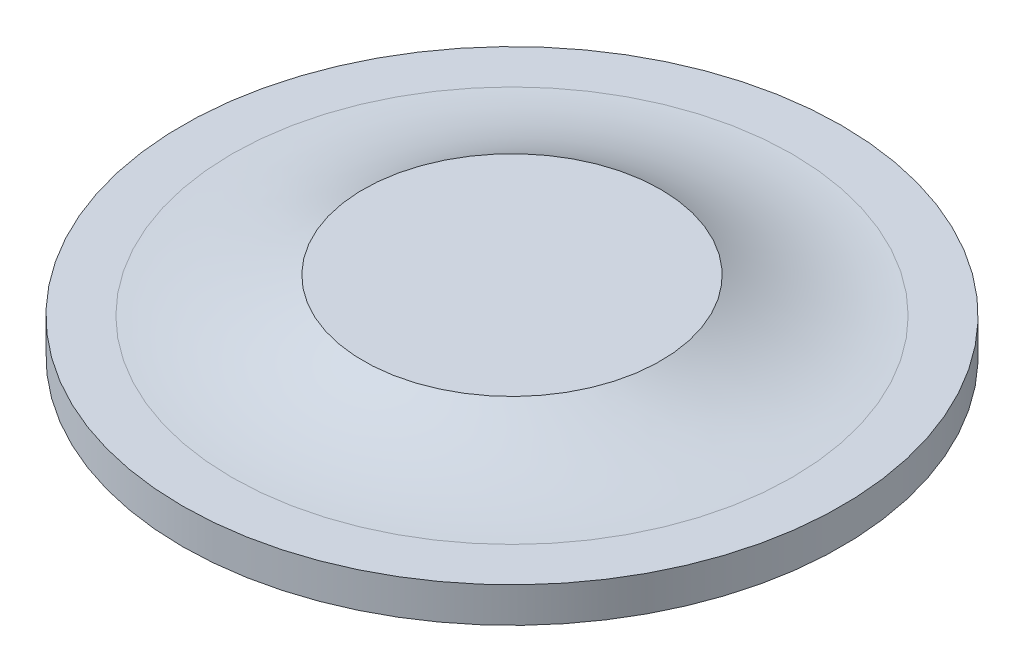
ISO-10303-21;
HEADER;
FILE_DESCRIPTION(('STEP AP214'),'2;1');
FILE_NAME('part.step','',(''),(''),'','','');
FILE_SCHEMA(('AUTOMOTIVE_DESIGN { 1 0 10303 214 1 1 1 1 }'));
ENDSEC;
DATA;
#1=APPLICATION_CONTEXT('core data for automotive mechanical design processes');
#2=APPLICATION_PROTOCOL_DEFINITION('international standard','automotive_design',2000,#1);
#3=PRODUCT_CONTEXT('',#1,'mechanical');
#4=PRODUCT('Part','Part','',(#3));
#5=PRODUCT_RELATED_PRODUCT_CATEGORY('part','',(#4));
#6=PRODUCT_DEFINITION_FORMATION('','',#4);
#7=PRODUCT_DEFINITION_CONTEXT('part definition',#1,'design');
#8=PRODUCT_DEFINITION('design','',#6,#7);
#9=PRODUCT_DEFINITION_SHAPE('','',#8);
#10=(LENGTH_UNIT() NAMED_UNIT(*) SI_UNIT(.MILLI.,.METRE.));
#11=(NAMED_UNIT(*) PLANE_ANGLE_UNIT() SI_UNIT($,.RADIAN.));
#12=(NAMED_UNIT(*) SI_UNIT($,.STERADIAN.) SOLID_ANGLE_UNIT());
#13=UNCERTAINTY_MEASURE_WITH_UNIT(LENGTH_MEASURE(1.E-05),#10,'distance_accuracy_value','');
#14=(GEOMETRIC_REPRESENTATION_CONTEXT(3) GLOBAL_UNCERTAINTY_ASSIGNED_CONTEXT((#13)) GLOBAL_UNIT_ASSIGNED_CONTEXT((#10,
#11,#12)) REPRESENTATION_CONTEXT('',''));
#15=CARTESIAN_POINT('',(0.,0.,0.));
#16=DIRECTION('',(0.,0.,1.));
#17=DIRECTION('',(1.,0.,0.));
#18=AXIS2_PLACEMENT_3D('',#15,#16,#17);
#19=CARTESIAN_POINT('',(0.,67.9531250000001,0.));
#20=DIRECTION('',(0.,-1.,0.));
#21=DIRECTION('',(0.,0.,-1.));
#22=AXIS2_PLACEMENT_3D('',#19,#20,#21);
#23=TOROIDAL_SURFACE('',#22,63.75,59.9531250000001);
#24=CARTESIAN_POINT('',(0.,8.00000000000001,0.));
#25=DIRECTION('',(0.,-1.,0.));
#26=DIRECTION('',(0.,0.,-1.));
#27=AXIS2_PLACEMENT_3D('',#24,#25,#26);
#28=CIRCLE('',#27,63.75);
#29=CARTESIAN_POINT('',(0.,8.00000000000001,-63.75));
#30=VERTEX_POINT('',#29);
#31=EDGE_CURVE('E57',#30,#30,#28,.T.);
#32=ORIENTED_EDGE('',*,*,#31,.F.);
#33=EDGE_LOOP('',(#32));
#34=FACE_BOUND('',#33,.T.);
#35=CARTESIAN_POINT('',(0.,16.,0.));
#36=DIRECTION('',(0.,-1.,0.));
#37=DIRECTION('',(0.,0.,-1.));
#38=AXIS2_PLACEMENT_3D('',#35,#36,#37);
#39=CIRCLE('',#38,33.8292713992456);
#40=CARTESIAN_POINT('',(0.,16.,-33.8292713992456));
#41=VERTEX_POINT('',#40);
#42=EDGE_CURVE('E10',#41,#41,#39,.T.);
#43=ORIENTED_EDGE('',*,*,#42,.T.);
#44=EDGE_LOOP('',(#43));
#45=FACE_BOUND('',#44,.T.);
#46=ADVANCED_FACE('F43',(#34,#45),#23,.F.);
#47=CARTESIAN_POINT('',(0.,16.,0.));
#48=DIRECTION('',(0.,1.,0.));
#49=DIRECTION('',(0.,0.,1.));
#50=AXIS2_PLACEMENT_3D('',#47,#48,#49);
#51=PLANE('',#50);
#52=ORIENTED_EDGE('',*,*,#42,.F.);
#53=EDGE_LOOP('',(#52));
#54=FACE_BOUND('',#53,.T.);
#55=ADVANCED_FACE('F66',(#54),#51,.T.);
#56=CARTESIAN_POINT('',(0.,0.,0.));
#57=DIRECTION('',(0.,-1.,0.));
#58=DIRECTION('',(0.,0.,-1.));
#59=AXIS2_PLACEMENT_3D('',#56,#57,#58);
#60=PLANE('',#59);
#61=CARTESIAN_POINT('',(0.,0.,0.));
#62=DIRECTION('',(0.,-1.,0.));
#63=DIRECTION('',(0.,0.,-1.));
#64=AXIS2_PLACEMENT_3D('',#61,#62,#63);
#65=CIRCLE('',#64,75.);
#66=CARTESIAN_POINT('',(0.,0.,-75.));
#67=VERTEX_POINT('',#66);
#68=EDGE_CURVE('E49',#67,#67,#65,.T.);
#69=ORIENTED_EDGE('',*,*,#68,.T.);
#70=EDGE_LOOP('',(#69));
#71=FACE_BOUND('',#70,.T.);
#72=ADVANCED_FACE('F70',(#71),#60,.T.);
#73=CARTESIAN_POINT('',(0.,0.,0.));
#74=DIRECTION('',(0.,-1.,0.));
#75=DIRECTION('',(0.,0.,-1.));
#76=AXIS2_PLACEMENT_3D('',#73,#74,#75);
#77=CYLINDRICAL_SURFACE('',#76,75.);
#78=CARTESIAN_POINT('',(0.,8.,0.));
#79=DIRECTION('',(0.,-1.,0.));
#80=DIRECTION('',(0.,0.,-1.));
#81=AXIS2_PLACEMENT_3D('',#78,#79,#80);
#82=CIRCLE('',#81,75.);
#83=CARTESIAN_POINT('',(0.,8.,-75.));
#84=VERTEX_POINT('',#83);
#85=EDGE_CURVE('E53',#84,#84,#82,.T.);
#86=ORIENTED_EDGE('',*,*,#85,.T.);
#87=EDGE_LOOP('',(#86));
#88=FACE_BOUND('',#87,.T.);
#89=ORIENTED_EDGE('',*,*,#68,.F.);
#90=EDGE_LOOP('',(#89));
#91=FACE_BOUND('',#90,.T.);
#92=ADVANCED_FACE('F75',(#88,#91),#77,.T.);
#93=CARTESIAN_POINT('',(0.,8.,0.));
#94=DIRECTION('',(0.,-1.,0.));
#95=DIRECTION('',(0.,0.,-1.));
#96=AXIS2_PLACEMENT_3D('',#93,#94,#95);
#97=PLANE('',#96);
#98=ORIENTED_EDGE('',*,*,#85,.F.);
#99=EDGE_LOOP('',(#98));
#100=FACE_BOUND('',#99,.T.);
#101=ORIENTED_EDGE('',*,*,#31,.T.);
#102=EDGE_LOOP('',(#101));
#103=FACE_BOUND('',#102,.T.);
#104=ADVANCED_FACE('F63',(#100,#103),#97,.F.);
#105=CLOSED_SHELL('',(#46,#55,#72,#92,#104));
#106=MANIFOLD_SOLID_BREP('B2',#105);
#107=ADVANCED_BREP_SHAPE_REPRESENTATION('',(#18,#106),#14);
#108=SHAPE_DEFINITION_REPRESENTATION(#9,#107);
ENDSEC;
END-ISO-10303-21;
